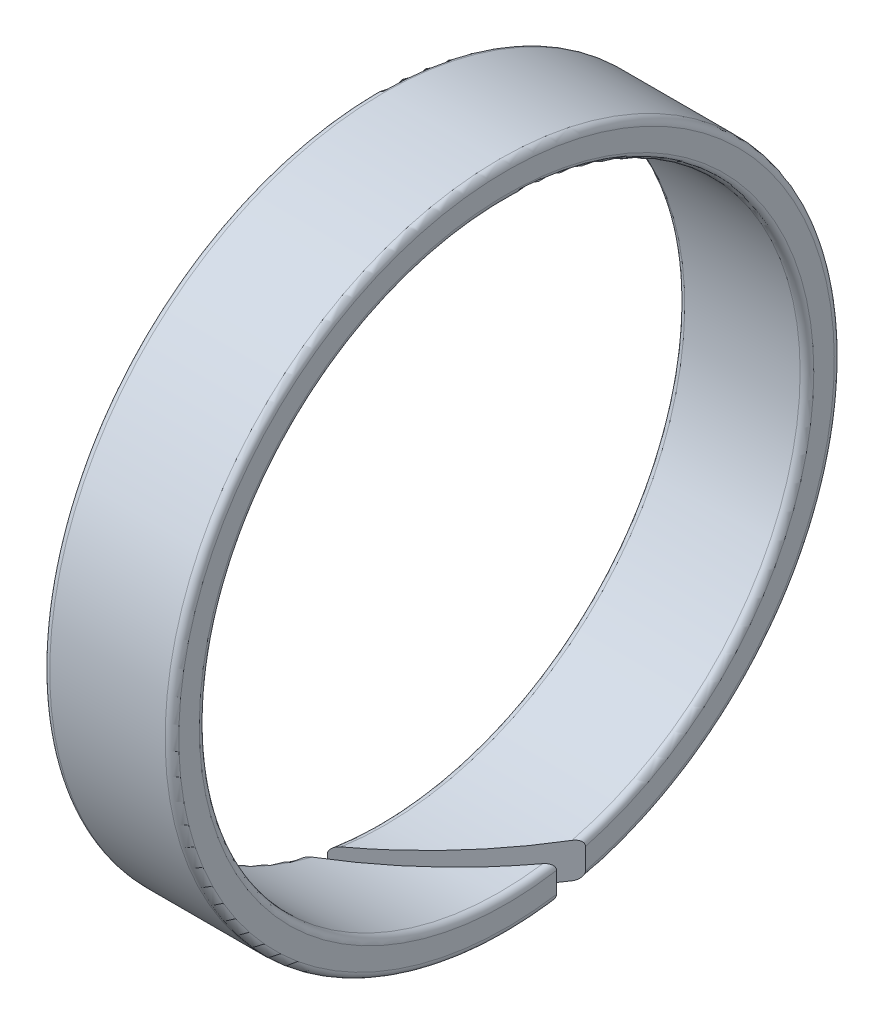
ISO-10303-21;
HEADER;
FILE_DESCRIPTION(('STEP AP214'),'2;1');
FILE_NAME('part.step','',(''),(''),'','','');
FILE_SCHEMA(('AUTOMOTIVE_DESIGN { 1 0 10303 214 1 1 1 1 }'));
ENDSEC;
DATA;
#1=APPLICATION_CONTEXT('core data for automotive mechanical design processes');
#2=APPLICATION_PROTOCOL_DEFINITION('international standard','automotive_design',2000,#1);
#3=PRODUCT_CONTEXT('',#1,'mechanical');
#4=PRODUCT('Part','Part','',(#3));
#5=PRODUCT_RELATED_PRODUCT_CATEGORY('part','',(#4));
#6=PRODUCT_DEFINITION_FORMATION('','',#4);
#7=PRODUCT_DEFINITION_CONTEXT('part definition',#1,'design');
#8=PRODUCT_DEFINITION('design','',#6,#7);
#9=PRODUCT_DEFINITION_SHAPE('','',#8);
#10=(LENGTH_UNIT() NAMED_UNIT(*) SI_UNIT(.MILLI.,.METRE.));
#11=(NAMED_UNIT(*) PLANE_ANGLE_UNIT() SI_UNIT($,.RADIAN.));
#12=(NAMED_UNIT(*) SI_UNIT($,.STERADIAN.) SOLID_ANGLE_UNIT());
#13=UNCERTAINTY_MEASURE_WITH_UNIT(LENGTH_MEASURE(1.E-05),#10,'distance_accuracy_value','');
#14=(GEOMETRIC_REPRESENTATION_CONTEXT(3) GLOBAL_UNCERTAINTY_ASSIGNED_CONTEXT((#13)) GLOBAL_UNIT_ASSIGNED_CONTEXT((#10,
#11,#12)) REPRESENTATION_CONTEXT('',''));
#15=CARTESIAN_POINT('',(0.,0.,0.));
#16=DIRECTION('',(0.,0.,1.));
#17=DIRECTION('',(1.,0.,0.));
#18=AXIS2_PLACEMENT_3D('',#15,#16,#17);
#19=CARTESIAN_POINT('',(4.72500000000009,0.,0.));
#20=DIRECTION('',(1.,0.,0.));
#21=DIRECTION('',(0.,0.,-1.));
#22=AXIS2_PLACEMENT_3D('',#19,#20,#21);
#23=PLANE('',#22);
#24=DIRECTION('',(0.,-1.,0.));
#25=VECTOR('',#24,1.);
#26=CARTESIAN_POINT('',(4.72500000000009,1.11022302462516E-13,-3.6643398282202));
#27=LINE('',#26,#25);
#28=CARTESIAN_POINT('',(4.72500000000009,-22.1996084114861,-3.66433982822021));
#29=VERTEX_POINT('',#28);
#30=CARTESIAN_POINT('',(4.72500000000009,-23.7186132314544,-3.6643398282202));
#31=VERTEX_POINT('',#30);
#32=EDGE_CURVE('E142',#29,#31,#27,.T.);
#33=ORIENTED_EDGE('',*,*,#32,.F.);
#34=CARTESIAN_POINT('',(4.72500000000009,0.,0.));
#35=DIRECTION('',(1.,0.,0.));
#36=DIRECTION('',(0.,0.,-1.));
#37=AXIS2_PLACEMENT_3D('',#34,#35,#36);
#38=CIRCLE('',#37,22.5);
#39=CARTESIAN_POINT('',(4.72500000000009,-21.7434159316489,-5.78566017177985));
#40=VERTEX_POINT('',#39);
#41=EDGE_CURVE('E11',#29,#40,#38,.F.);
#42=ORIENTED_EDGE('',*,*,#41,.T.);
#43=DIRECTION('',(0.,1.,0.));
#44=VECTOR('',#43,1.);
#45=CARTESIAN_POINT('',(4.72500000000009,-24.5,-5.78566017177985));
#46=LINE('',#45,#44);
#47=CARTESIAN_POINT('',(4.72500000000009,-23.2921904589647,-5.78566017177986));
#48=VERTEX_POINT('',#47);
#49=EDGE_CURVE('E251',#48,#40,#46,.T.);
#50=ORIENTED_EDGE('',*,*,#49,.F.);
#51=CARTESIAN_POINT('',(4.72500000000009,0.,0.));
#52=DIRECTION('',(1.,0.,0.));
#53=DIRECTION('',(0.,0.,-1.));
#54=AXIS2_PLACEMENT_3D('',#51,#52,#53);
#55=CIRCLE('',#54,24.);
#56=EDGE_CURVE('E50',#48,#31,#55,.T.);
#57=ORIENTED_EDGE('',*,*,#56,.T.);
#58=EDGE_LOOP('',(#33,#42,#50,#57));
#59=FACE_BOUND('',#58,.T.);
#60=ADVANCED_FACE('F41',(#59),#23,.T.);
#61=CARTESIAN_POINT('',(-4.72500000000009,0.,0.));
#62=DIRECTION('',(1.,0.,0.));
#63=DIRECTION('',(0.,0.,-1.));
#64=AXIS2_PLACEMENT_3D('',#61,#62,#63);
#65=PLANE('',#64);
#66=DIRECTION('',(0.,-1.,0.));
#67=VECTOR('',#66,1.);
#68=CARTESIAN_POINT('',(-4.72500000000009,0.,5.65562475744677));
#69=LINE('',#68,#67);
#70=CARTESIAN_POINT('',(-4.72500000000009,-21.7776010754847,5.65562475744677));
#71=VERTEX_POINT('',#70);
#72=CARTESIAN_POINT('',(-4.72500000000009,-23.3241057406913,5.65562475744677));
#73=VERTEX_POINT('',#72);
#74=EDGE_CURVE('E146',#71,#73,#69,.T.);
#75=ORIENTED_EDGE('',*,*,#74,.T.);
#76=CARTESIAN_POINT('',(-4.72500000000009,0.,0.));
#77=DIRECTION('',(1.,0.,0.));
#78=DIRECTION('',(0.,0.,-1.));
#79=AXIS2_PLACEMENT_3D('',#76,#77,#78);
#80=CIRCLE('',#79,24.);
#81=CARTESIAN_POINT('',(-4.72500000000009,-23.7186132314542,3.6643398282202));
#82=VERTEX_POINT('',#81);
#83=EDGE_CURVE('E210',#73,#82,#80,.F.);
#84=ORIENTED_EDGE('',*,*,#83,.T.);
#85=DIRECTION('',(0.,1.,0.));
#86=VECTOR('',#85,1.);
#87=CARTESIAN_POINT('',(-4.72500000000009,0.,3.66433982822019));
#88=LINE('',#87,#86);
#89=CARTESIAN_POINT('',(-4.72500000000009,-22.1996084114861,3.6643398282202));
#90=VERTEX_POINT('',#89);
#91=EDGE_CURVE('E265',#82,#90,#88,.T.);
#92=ORIENTED_EDGE('',*,*,#91,.T.);
#93=CARTESIAN_POINT('',(-4.72500000000009,0.,0.));
#94=DIRECTION('',(1.,0.,0.));
#95=DIRECTION('',(0.,0.,-1.));
#96=AXIS2_PLACEMENT_3D('',#93,#94,#95);
#97=CIRCLE('',#96,22.5);
#98=EDGE_CURVE('E207',#90,#71,#97,.T.);
#99=ORIENTED_EDGE('',*,*,#98,.T.);
#100=EDGE_LOOP('',(#75,#84,#92,#99));
#101=FACE_BOUND('',#100,.T.);
#102=ADVANCED_FACE('F264',(#101),#65,.F.);
#103=CARTESIAN_POINT('',(4.72500000000009,0.,0.));
#104=DIRECTION('',(-1.,0.,0.));
#105=DIRECTION('',(0.,0.,1.));
#106=AXIS2_PLACEMENT_3D('',#103,#104,#105);
#107=CYLINDRICAL_SURFACE('',#106,24.5);
#108=CARTESIAN_POINT('',(-1.06066017177975,0.,0.));
#109=DIRECTION('',(-0.707106781186549,0.,-0.707106781186548));
#110=DIRECTION('',(-0.707106781186546,0.,0.70710678118655));
#111=AXIS2_PLACEMENT_3D('',#108,#109,#110);
#112=ELLIPSE('',#111,34.6482322781408,24.5);
#113=CARTESIAN_POINT('',(4.22499999999992,-23.923039032457,-5.28566017177984));
#114=VERTEX_POINT('',#113);
#115=CARTESIAN_POINT('',(-4.22499999999992,-24.294792722959,3.1643398282202));
#116=VERTEX_POINT('',#115);
#117=EDGE_CURVE('E135',#114,#116,#112,.T.);
#118=ORIENTED_EDGE('',*,*,#117,.T.);
#119=CARTESIAN_POINT('',(-4.22499999999992,0.,0.));
#120=DIRECTION('',(1.,0.,0.));
#121=DIRECTION('',(0.,0.,-1.));
#122=AXIS2_PLACEMENT_3D('',#119,#120,#121);
#123=CIRCLE('',#122,24.5);
#124=CARTESIAN_POINT('',(-4.22499999999992,-23.923039032457,5.28566017177985));
#125=VERTEX_POINT('',#124);
#126=EDGE_CURVE('E118',#116,#125,#123,.T.);
#127=ORIENTED_EDGE('',*,*,#126,.T.);
#128=CARTESIAN_POINT('',(1.06066017177975,0.,0.));
#129=DIRECTION('',(0.707106781186549,0.,0.707106781186547));
#130=DIRECTION('',(-0.707106781186546,0.,0.707106781186551));
#131=AXIS2_PLACEMENT_3D('',#128,#129,#130);
#132=ELLIPSE('',#131,34.6482322781408,24.5);
#133=CARTESIAN_POINT('',(4.22499999999992,-24.2947927229589,-3.1643398282202));
#134=VERTEX_POINT('',#133);
#135=EDGE_CURVE('E132',#125,#134,#132,.T.);
#136=ORIENTED_EDGE('',*,*,#135,.T.);
#137=CARTESIAN_POINT('',(4.22499999999992,0.,0.));
#138=DIRECTION('',(1.,0.,0.));
#139=DIRECTION('',(0.,0.,-1.));
#140=AXIS2_PLACEMENT_3D('',#137,#138,#139);
#141=CIRCLE('',#140,24.5);
#142=EDGE_CURVE('E137',#134,#114,#141,.F.);
#143=ORIENTED_EDGE('',*,*,#142,.T.);
#144=EDGE_LOOP('',(#118,#127,#136,#143));
#145=FACE_BOUND('',#144,.T.);
#146=ADVANCED_FACE('F131',(#145),#107,.T.);
#147=CARTESIAN_POINT('',(4.72500000000009,0.,0.));
#148=DIRECTION('',(-1.,0.,0.));
#149=DIRECTION('',(0.,0.,1.));
#150=AXIS2_PLACEMENT_3D('',#147,#148,#149);
#151=CYLINDRICAL_SURFACE('',#150,22.);
#152=CARTESIAN_POINT('',(1.06066017177975,0.,0.));
#153=DIRECTION('',(0.707106781186549,0.,0.707106781186547));
#154=DIRECTION('',(-0.707106781186546,0.,0.707106781186551));
#155=AXIS2_PLACEMENT_3D('',#152,#153,#154);
#156=ELLIPSE('',#155,31.112698372208,22.);
#157=CARTESIAN_POINT('',(-4.22499999999992,-21.3556033993062,5.28566017177986));
#158=VERTEX_POINT('',#157);
#159=CARTESIAN_POINT('',(4.22499999999992,-21.7712414311068,-3.1643398282202));
#160=VERTEX_POINT('',#159);
#161=EDGE_CURVE('E144',#158,#160,#156,.T.);
#162=ORIENTED_EDGE('',*,*,#161,.F.);
#163=CARTESIAN_POINT('',(-4.22499999999992,0.,0.));
#164=DIRECTION('',(1.,0.,0.));
#165=DIRECTION('',(0.,0.,-1.));
#166=AXIS2_PLACEMENT_3D('',#163,#164,#165);
#167=CIRCLE('',#166,22.);
#168=CARTESIAN_POINT('',(-4.22499999999992,-21.7712414311068,3.16433982822018));
#169=VERTEX_POINT('',#168);
#170=EDGE_CURVE('E57',#158,#169,#167,.F.);
#171=ORIENTED_EDGE('',*,*,#170,.T.);
#172=CARTESIAN_POINT('',(-1.06066017177975,0.,0.));
#173=DIRECTION('',(-0.707106781186549,0.,-0.707106781186548));
#174=DIRECTION('',(-0.707106781186546,0.,0.70710678118655));
#175=AXIS2_PLACEMENT_3D('',#172,#173,#174);
#176=ELLIPSE('',#175,31.112698372208,22.);
#177=CARTESIAN_POINT('',(4.22499999999992,-21.3556033993062,-5.28566017177985));
#178=VERTEX_POINT('',#177);
#179=EDGE_CURVE('E141',#178,#169,#176,.T.);
#180=ORIENTED_EDGE('',*,*,#179,.F.);
#181=CARTESIAN_POINT('',(4.22499999999992,0.,0.));
#182=DIRECTION('',(1.,0.,0.));
#183=DIRECTION('',(0.,0.,-1.));
#184=AXIS2_PLACEMENT_3D('',#181,#182,#183);
#185=CIRCLE('',#184,22.);
#186=EDGE_CURVE('E242',#178,#160,#185,.T.);
#187=ORIENTED_EDGE('',*,*,#186,.T.);
#188=EDGE_LOOP('',(#162,#171,#180,#187));
#189=FACE_BOUND('',#188,.T.);
#190=ADVANCED_FACE('F225',(#189),#151,.F.);
#191=CARTESIAN_POINT('',(4.72500000000009,-24.5,-5.78566017177985));
#192=DIRECTION('',(-0.707106781186549,0.,-0.707106781186548));
#193=DIRECTION('',(-0.707106781186546,0.,0.70710678118655));
#194=AXIS2_PLACEMENT_3D('',#191,#192,#193);
#195=PLANE('',#194);
#196=ORIENTED_EDGE('',*,*,#91,.F.);
#197=CARTESIAN_POINT('',(-4.72500000000009,-23.7186132314542,3.6643398282202));
#198=CARTESIAN_POINT('',(-4.72502574535306,-23.7434351918554,3.66436557357337));
#199=CARTESIAN_POINT('',(-4.72319771201983,-23.7681376161173,3.66253754024013));
#200=CARTESIAN_POINT('',(-4.7163786361888,-23.816406350749,3.655718464409));
#201=CARTESIAN_POINT('',(-4.71142041544761,-23.8399817519745,3.65076024366771));
#202=CARTESIAN_POINT('',(-4.69889986263721,-23.8855105801526,3.63823969085734));
#203=CARTESIAN_POINT('',(-4.69135220603893,-23.9074723186344,3.63069203425917));
#204=CARTESIAN_POINT('',(-4.67412939870489,-23.9497169507442,3.61346922692514));
#205=CARTESIAN_POINT('',(-4.66444792037909,-23.9699945988448,3.60378774859923));
#206=CARTESIAN_POINT('',(-4.63759007168309,-24.0193511593527,3.57692989990313));
#207=CARTESIAN_POINT('',(-4.61922084837744,-24.0471338238574,3.55856067659763));
#208=CARTESIAN_POINT('',(-4.57959902970563,-24.0982141491201,3.51893885792595));
#209=CARTESIAN_POINT('',(-4.55834069055153,-24.1215026460847,3.49768051877184));
#210=CARTESIAN_POINT('',(-4.50626611768633,-24.1708032212297,3.44560594590661));
#211=CARTESIAN_POINT('',(-4.47463875436181,-24.1951003110115,3.41397858258208));
#212=CARTESIAN_POINT('',(-4.4090496578634,-24.2361327057072,3.34838948608362));
#213=CARTESIAN_POINT('',(-4.37508755648262,-24.2528668147118,3.31442738470282));
#214=CARTESIAN_POINT('',(-4.32149782090872,-24.2729421542483,3.26083764912893));
#215=CARTESIAN_POINT('',(-4.30234382523602,-24.2789166029107,3.24168365345625));
#216=CARTESIAN_POINT('',(-4.26382013578095,-24.2885682227616,3.20315996400121));
#217=CARTESIAN_POINT('',(-4.24445147403079,-24.2922536330969,3.18379130225107));
#218=CARTESIAN_POINT('',(-4.22499999999992,-24.294792722959,3.1643398282202));
#219=B_SPLINE_CURVE_WITH_KNOTS('',3,(#197,#198,#199,#200,#201,#202,#203,#204,#205,#206,#207,
#208,#209,#210,#211,#212,#213,#214,#215,#216,#217,#218),.UNSPECIFIED.,.F.,.F.,(4,2,2,2,2,2,2,2,
2,2,4),(0.,0.0741535930199235,0.147542272828984,0.220521715661739,0.293720553752011,
0.407194763510153,0.520897962145091,0.672813646074002,0.824753343529323,0.907884486703509,
0.990714647419734),.UNSPECIFIED.);
#220=EDGE_CURVE('E236',#82,#116,#219,.T.);
#221=ORIENTED_EDGE('',*,*,#220,.T.);
#222=ORIENTED_EDGE('',*,*,#117,.F.);
#223=CARTESIAN_POINT('',(4.22499999999992,-23.923039032457,-5.28566017177984));
#224=CARTESIAN_POINT('',(4.24494577581343,-23.9186245205073,-5.30560594759326));
#225=CARTESIAN_POINT('',(4.26474376324025,-23.913009585674,-5.32540393502003));
#226=CARTESIAN_POINT('',(4.30394457164939,-23.8994475482932,-5.36460474342914));
#227=CARTESIAN_POINT('',(4.32334723916251,-23.8914995577955,-5.38400741094227));
#228=CARTESIAN_POINT('',(4.3810285456558,-23.8641524933544,-5.44168871743558));
#229=CARTESIAN_POINT('',(4.41852925524987,-23.8413069213466,-5.47918942702968));
#230=CARTESIAN_POINT('',(4.48389383898145,-23.7915414722216,-5.54455401076122));
#231=CARTESIAN_POINT('',(4.51229833043169,-23.7660250811168,-5.5729585022114));
#232=CARTESIAN_POINT('',(4.5658518846688,-23.708959159415,-5.62651205644861));
#233=CARTESIAN_POINT('',(4.59101042994047,-23.6774279014211,-5.65167060172044));
#234=CARTESIAN_POINT('',(4.62968548568362,-23.6189342191185,-5.69034565746352));
#235=CARTESIAN_POINT('',(4.6444011572704,-23.593555564788,-5.70506132905019));
#236=CARTESIAN_POINT('',(4.67096178838825,-23.5399081942305,-5.73162196016799));
#237=CARTESIAN_POINT('',(4.682808943212,-23.5116417117846,-5.7434691149918));
#238=CARTESIAN_POINT('',(4.70034265692375,-23.4595483197467,-5.76100282870357));
#239=CARTESIAN_POINT('',(4.70682393104252,-23.4362585301551,-5.76748410282231));
#240=CARTESIAN_POINT('',(4.71704725724746,-23.3885408687962,-5.7777074290272));
#241=CARTESIAN_POINT('',(4.72079872433679,-23.3641172207883,-5.78145889611651));
#242=CARTESIAN_POINT('',(4.72429721960384,-23.3237604529211,-5.78495739138359));
#243=CARTESIAN_POINT('',(4.72500643457529,-23.3079847597282,-5.78566660635506));
#244=CARTESIAN_POINT('',(4.72500000000009,-23.2921904589647,-5.78566017177992));
#245=B_SPLINE_CURVE_WITH_KNOTS('',3,(#223,#224,#225,#226,#227,#228,#229,#230,#231,#232,#233,
#234,#235,#236,#237,#238,#239,#240,#241,#242,#243,#244),.UNSPECIFIED.,.F.,.F.,(4,2,2,2,2,2,2,2,
2,2,4),(0.,0.0855869288494878,0.171206474014893,0.343511969365694,0.485794995666126,
0.627652471578651,0.725819855262002,0.82391187171158,0.898738585290563,0.973305985024754,
1.0206353079187),.UNSPECIFIED.);
#246=EDGE_CURVE('E212',#114,#48,#245,.T.);
#247=ORIENTED_EDGE('',*,*,#246,.T.);
#248=ORIENTED_EDGE('',*,*,#49,.T.);
#249=CARTESIAN_POINT('',(4.72500000000009,-21.7434159316489,-5.78566017177985));
#250=CARTESIAN_POINT('',(4.72503080217776,-21.723422635209,-5.78569097395744));
#251=CARTESIAN_POINT('',(4.72388209365464,-21.7034051051762,-5.78454226543435));
#252=CARTESIAN_POINT('',(4.71922587907662,-21.6639725681301,-5.77988605085644));
#253=CARTESIAN_POINT('',(4.71572329389258,-21.6445563923636,-5.77638346567247));
#254=CARTESIAN_POINT('',(4.70634736805702,-21.6068395114554,-5.76700753983687));
#255=CARTESIAN_POINT('',(4.70046780379788,-21.5885418809002,-5.76112797557762));
#256=CARTESIAN_POINT('',(4.6865754424967,-21.5536685061576,-5.74723561427648));
#257=CARTESIAN_POINT('',(4.67856357235355,-21.5370920181431,-5.73922374413349));
#258=CARTESIAN_POINT('',(4.66093399072649,-21.5063028595342,-5.72159416250644));
#259=CARTESIAN_POINT('',(4.65135095250732,-21.4920501182704,-5.71201112428713));
#260=CARTESIAN_POINT('',(4.63083771558794,-21.4656396704597,-5.69149788736766));
#261=CARTESIAN_POINT('',(4.61990635755794,-21.4534837887038,-5.68056652933772));
#262=CARTESIAN_POINT('',(4.59127737891901,-21.4256628503244,-5.65193755069883));
#263=CARTESIAN_POINT('',(4.57294208204752,-21.4113082712652,-5.6336022538273));
#264=CARTESIAN_POINT('',(4.53488651815525,-21.3869204873307,-5.595546689935));
#265=CARTESIAN_POINT('',(4.51516307379353,-21.376897597806,-5.57582324557329));
#266=CARTESIAN_POINT('',(4.46604892493506,-21.3570969151367,-5.52670909671483));
#267=CARTESIAN_POINT('',(4.43624374075571,-21.3493916535786,-5.49690391253547));
#268=CARTESIAN_POINT('',(4.37616198080344,-21.3406593775155,-5.4368221525832));
#269=CARTESIAN_POINT('',(4.34588478657716,-21.3396420209315,-5.40654495835693));
#270=CARTESIAN_POINT('',(4.3004704473881,-21.3424441711289,-5.36113061916785));
#271=CARTESIAN_POINT('',(4.28524861409996,-21.3441210437257,-5.34590878587971));
#272=CARTESIAN_POINT('',(4.25499211660827,-21.3488546450069,-5.31565228838805));
#273=CARTESIAN_POINT('',(4.239956890864,-21.3519041598656,-5.30061706264383));
#274=CARTESIAN_POINT('',(4.22499999999992,-21.3556033993062,-5.28566017177985));
#275=B_SPLINE_CURVE_WITH_KNOTS('',3,(#249,#250,#251,#252,#253,#254,#255,#256,#257,#258,#259,
#260,#261,#262,#263,#264,#265,#266,#267,#268,#269,#270,#271,#272,#273,#274),.UNSPECIFIED.,.F.,
.F.,(4,2,2,2,2,2,2,2,2,2,2,2,4),(0.,0.0599463639295992,0.119767795885666,0.179746882395255,
0.239699938867074,0.298474139996363,0.357299234091442,0.445713654335123,0.53433747707352,
0.66219223371116,0.790231583339687,0.854969522164011,0.919371137300166),.UNSPECIFIED.);
#276=EDGE_CURVE('E64',#40,#178,#275,.T.);
#277=ORIENTED_EDGE('',*,*,#276,.T.);
#278=ORIENTED_EDGE('',*,*,#179,.T.);
#279=CARTESIAN_POINT('',(-4.22499999999992,-21.7712414311068,3.16433982822019));
#280=CARTESIAN_POINT('',(-4.24371416488033,-21.768527773343,3.18305399310059));
#281=CARTESIAN_POINT('',(-4.26250800503816,-21.7668275169239,3.20184783325842));
#282=CARTESIAN_POINT('',(-4.30017324665307,-21.7655669189806,3.23951307487331));
#283=CARTESIAN_POINT('',(-4.31904472731068,-21.7660114495524,3.25838455553092));
#284=CARTESIAN_POINT('',(-4.35691817784309,-21.7691854400539,3.29625800606334));
#285=CARTESIAN_POINT('',(-4.37591908042947,-21.7719416508372,3.31525890864973));
#286=CARTESIAN_POINT('',(-4.4136393944048,-21.779942981608,3.35297922262504));
#287=CARTESIAN_POINT('',(-4.43235908160961,-21.7851854728201,3.37169890982983));
#288=CARTESIAN_POINT('',(-4.47350628857235,-21.7998654928169,3.41284611679257));
#289=CARTESIAN_POINT('',(-4.49581644367145,-21.8099830301493,3.43515627189171));
#290=CARTESIAN_POINT('',(-4.53909430169969,-21.8347343662532,3.47843412991993));
#291=CARTESIAN_POINT('',(-4.56006650872517,-21.8493519289904,3.49940633694535));
#292=CARTESIAN_POINT('',(-4.5954514934466,-21.8797867720102,3.53479132166682));
#293=CARTESIAN_POINT('',(-4.61028631675471,-21.8946157584383,3.54962614497499));
#294=CARTESIAN_POINT('',(-4.63809150044759,-21.9274509274748,3.57743132866782));
#295=CARTESIAN_POINT('',(-4.65106417863904,-21.94545309711,3.59040400685914));
#296=CARTESIAN_POINT('',(-4.67232411089204,-21.981001848293,3.61166393911215));
#297=CARTESIAN_POINT('',(-4.6810344272428,-21.9980403513671,3.62037425546301));
#298=CARTESIAN_POINT('',(-4.69632505388754,-22.0339304816589,3.63566488210784));
#299=CARTESIAN_POINT('',(-4.7029075302434,-22.0527802395604,3.64224735846369));
#300=CARTESIAN_POINT('',(-4.71377312201837,-22.0924858685557,3.65311295023865));
#301=CARTESIAN_POINT('',(-4.71797342413932,-22.1133873486408,3.6573132523596));
#302=CARTESIAN_POINT('',(-4.72361827990202,-22.1560578735107,3.66295810812224));
#303=CARTESIAN_POINT('',(-4.72504517726632,-22.1778315819392,3.6643850054865));
#304=CARTESIAN_POINT('',(-4.72500000000009,-22.1996084114861,3.6643398282202));
#305=B_SPLINE_CURVE_WITH_KNOTS('',3,(#279,#280,#281,#282,#283,#284,#285,#286,#287,#288,#289,
#290,#291,#292,#293,#294,#295,#296,#297,#298,#299,#300,#301,#302,#303,#304),.UNSPECIFIED.,.F.,
.F.,(4,2,2,2,2,2,2,2,2,2,2,2,4),(0.,0.0798069715620714,0.159795317800918,0.240722271860277,
0.321563850952885,0.420662149858195,0.519407012660938,0.596210689582476,0.672917924468527,
0.735731398213507,0.798480727337478,0.86329541380493,0.928521394526833),.UNSPECIFIED.);
#306=EDGE_CURVE('E231',#169,#90,#305,.T.);
#307=ORIENTED_EDGE('',*,*,#306,.T.);
#308=EDGE_LOOP('',(#196,#221,#222,#247,#248,#277,#278,#307));
#309=FACE_BOUND('',#308,.T.);
#310=ADVANCED_FACE('F169',(#309),#195,.F.);
#311=CARTESIAN_POINT('',(5.78566017177984,-24.5000000000001,-4.72500000000004));
#312=DIRECTION('',(0.707106781186549,0.,0.707106781186547));
#313=DIRECTION('',(0.707106781186546,0.,-0.707106781186551));
#314=AXIS2_PLACEMENT_3D('',#311,#312,#313);
#315=PLANE('',#314);
#316=ORIENTED_EDGE('',*,*,#135,.F.);
#317=CARTESIAN_POINT('',(-4.22499999999992,-23.923039032457,5.28566017177985));
#318=CARTESIAN_POINT('',(-4.24490806013504,-23.9186327935129,5.3055682319149));
#319=CARTESIAN_POINT('',(-4.26466869211361,-23.9130308481497,5.32532886389345));
#320=CARTESIAN_POINT('',(-4.30379710789867,-23.899503271281,5.36445727967849));
#321=CARTESIAN_POINT('',(-4.32316472747462,-23.8915766889072,5.38382489925445));
#322=CARTESIAN_POINT('',(-4.38088847877863,-23.8642377263435,5.44154865055846));
#323=CARTESIAN_POINT('',(-4.41846325323354,-23.8413565501313,5.47912342501336));
#324=CARTESIAN_POINT('',(-4.48394092310796,-23.7915061381064,5.54460109488775));
#325=CARTESIAN_POINT('',(-4.51238758390936,-23.7659463612653,5.57304775568913));
#326=CARTESIAN_POINT('',(-4.56593618547184,-23.7088529827474,5.62659635725172));
#327=CARTESIAN_POINT('',(-4.59105779076058,-23.6773574449405,5.65171796254059));
#328=CARTESIAN_POINT('',(-4.62222902609316,-23.6302112328972,5.68288919787308));
#329=CARTESIAN_POINT('',(-4.63027962468818,-23.6171613182242,5.69093979646804));
#330=CARTESIAN_POINT('',(-4.64568260822904,-23.590225606047,5.70634278000884));
#331=CARTESIAN_POINT('',(-4.65303374524748,-23.5763383841919,5.71369391702727));
#332=CARTESIAN_POINT('',(-4.65998229283349,-23.5620411070319,5.72064246461332));
#333=B_SPLINE_CURVE_WITH_KNOTS('',3,(#317,#318,#319,#320,#321,#322,#323,#324,#325,#326,#327,
#328,#329,#330,#331,#332),.UNSPECIFIED.,.F.,.F.,(4,2,2,2,2,2,2,4),(0.,0.0854246824684147,
0.170884355853425,0.343511098118828,0.486023696420126,0.62765172804726,0.679566522392057,
0.731572267579096),.UNSPECIFIED.);
#334=CARTESIAN_POINT('',(-4.65998229283349,-23.5620411070319,5.72064246461332));
#335=VERTEX_POINT('',#334);
#336=EDGE_CURVE('E114',#125,#335,#333,.T.);
#337=ORIENTED_EDGE('',*,*,#336,.T.);
#338=DIRECTION('',(0.,1.,0.));
#339=VECTOR('',#338,1.);
#340=CARTESIAN_POINT('',(-4.65998229283349,-24.5,5.72064246461331));
#341=LINE('',#340,#339);
#342=CARTESIAN_POINT('',(-4.65998229283349,-21.5055799868962,5.72064246461332));
#343=VERTEX_POINT('',#342);
#344=EDGE_CURVE('E270',#335,#343,#341,.T.);
#345=ORIENTED_EDGE('',*,*,#344,.T.);
#346=CARTESIAN_POINT('',(-4.65998229283349,-21.5055799868962,5.72064246461332));
#347=CARTESIAN_POINT('',(-4.64681472615512,-21.4850336125127,5.707474897935));
#348=CARTESIAN_POINT('',(-4.63215591485567,-21.4666602355498,5.69281608663553));
#349=CARTESIAN_POINT('',(-4.60092455402185,-21.4342898026785,5.66158472580165));
#350=CARTESIAN_POINT('',(-4.58438540708571,-21.420228978123,5.64504557886546));
#351=CARTESIAN_POINT('',(-4.54539484570327,-21.3926279667466,5.60605501748301));
#352=CARTESIAN_POINT('',(-4.52254646889172,-21.3802361716067,5.58320664067152));
#353=CARTESIAN_POINT('',(-4.47553678969251,-21.3606145749274,5.53619696147237));
#354=CARTESIAN_POINT('',(-4.45136349381093,-21.3534451997424,5.51202366559078));
#355=CARTESIAN_POINT('',(-4.39309897027911,-21.3418570893625,5.45375914205896));
#356=CARTESIAN_POINT('',(-4.35879382942348,-21.3395802955944,5.41945400120333));
#357=CARTESIAN_POINT('',(-4.30790405028988,-21.341752393338,5.36856422206971));
#358=CARTESIAN_POINT('',(-4.29121413343926,-21.3433609833499,5.35187430521908));
#359=CARTESIAN_POINT('',(-4.25798647990944,-21.3482549459218,5.31864665168928));
#360=CARTESIAN_POINT('',(-4.24144852733349,-21.3515373667114,5.30210869911336));
#361=CARTESIAN_POINT('',(-4.22499999999992,-21.3556033993062,5.28566017177986));
#362=B_SPLINE_CURVE_WITH_KNOTS('',3,(#346,#347,#348,#349,#350,#351,#352,#353,#354,#355,#356,
#357,#358,#359,#360,#361),.UNSPECIFIED.,.F.,.F.,(4,2,2,2,2,2,2,4),(0.,0.0827427628214315,
0.164195404629559,0.267466799064233,0.371914902979448,0.516830887378037,0.587760842149745,
0.658566143573506),.UNSPECIFIED.);
#363=EDGE_CURVE('E126',#343,#158,#362,.T.);
#364=ORIENTED_EDGE('',*,*,#363,.T.);
#365=ORIENTED_EDGE('',*,*,#161,.T.);
#366=CARTESIAN_POINT('',(4.22499999999992,-21.7712414311068,-3.1643398282202));
#367=CARTESIAN_POINT('',(4.24371416488037,-21.768527773343,-3.18305399310059));
#368=CARTESIAN_POINT('',(4.26250800503822,-21.7668275169239,-3.20184783325842));
#369=CARTESIAN_POINT('',(4.30017324665315,-21.7655669189806,-3.23951307487334));
#370=CARTESIAN_POINT('',(4.31904472731076,-21.7660114495524,-3.25838455553095));
#371=CARTESIAN_POINT('',(4.35691817784317,-21.7691854400539,-3.29625800606336));
#372=CARTESIAN_POINT('',(4.37591908042954,-21.7719416508372,-3.31525890864973));
#373=CARTESIAN_POINT('',(4.41363939440483,-21.779942981608,-3.35297922262503));
#374=CARTESIAN_POINT('',(4.43235908160962,-21.7851854728201,-3.37169890982983));
#375=CARTESIAN_POINT('',(4.47350628857236,-21.7998654928169,-3.41284611679257));
#376=CARTESIAN_POINT('',(4.4958164436715,-21.8099830301493,-3.4351562718917));
#377=CARTESIAN_POINT('',(4.53909430169973,-21.8347343662533,-3.47843412991991));
#378=CARTESIAN_POINT('',(4.56006650872514,-21.8493519289907,-3.49940633694532));
#379=CARTESIAN_POINT('',(4.5954514934466,-21.8797867720104,-3.5347913216668));
#380=CARTESIAN_POINT('',(4.61028631675476,-21.8946157584384,-3.54962614497497));
#381=CARTESIAN_POINT('',(4.63809150044765,-21.9274509274748,-3.57743132866782));
#382=CARTESIAN_POINT('',(4.65106417863906,-21.94545309711,-3.59040400685916));
#383=CARTESIAN_POINT('',(4.67232411089204,-21.981001848293,-3.61166393911215));
#384=CARTESIAN_POINT('',(4.68103442724282,-21.9980403513671,-3.62037425546297));
#385=CARTESIAN_POINT('',(4.69632505388756,-22.033930481659,-3.63566488210781));
#386=CARTESIAN_POINT('',(4.7029075302434,-22.0527802395605,-3.64224735846369));
#387=CARTESIAN_POINT('',(4.71377312201836,-22.0924858685558,-3.65311295023866));
#388=CARTESIAN_POINT('',(4.71797342413933,-22.1133873486409,-3.65731325235957));
#389=CARTESIAN_POINT('',(4.72361827990203,-22.1560578735108,-3.66295810812218));
#390=CARTESIAN_POINT('',(4.72504517726634,-22.1778315819392,-3.66438500548644));
#391=CARTESIAN_POINT('',(4.72500000000009,-22.1996084114861,-3.66433982822021));
#392=B_SPLINE_CURVE_WITH_KNOTS('',3,(#366,#367,#368,#369,#370,#371,#372,#373,#374,#375,#376,
#377,#378,#379,#380,#381,#382,#383,#384,#385,#386,#387,#388,#389,#390,#391),.UNSPECIFIED.,.F.,
.F.,(4,2,2,2,2,2,2,2,2,2,2,2,4),(0.,0.0798069715621202,0.159795317801006,0.240722271860308,
0.321563850952868,0.420662149858207,0.519407012661017,0.596210689582502,0.672917924468475,
0.735731398213495,0.798480727337523,0.86329541380494,0.928521394526763),.UNSPECIFIED.);
#393=EDGE_CURVE('E159',#160,#29,#392,.T.);
#394=ORIENTED_EDGE('',*,*,#393,.T.);
#395=ORIENTED_EDGE('',*,*,#32,.T.);
#396=CARTESIAN_POINT('',(4.72500000000009,-23.7186132314544,-3.6643398282202));
#397=CARTESIAN_POINT('',(4.72502574535307,-23.7434351918556,-3.66436557357328));
#398=CARTESIAN_POINT('',(4.72319771201982,-23.7681376161174,-3.66253754024004));
#399=CARTESIAN_POINT('',(4.71637863618878,-23.8164063507491,-3.65571846440895));
#400=CARTESIAN_POINT('',(4.71142041544758,-23.8399817519746,-3.65076024366771));
#401=CARTESIAN_POINT('',(4.69889986263723,-23.8855105801526,-3.63823969085734));
#402=CARTESIAN_POINT('',(4.69135220603899,-23.9074723186344,-3.63069203425913));
#403=CARTESIAN_POINT('',(4.67412939870485,-23.9497169507441,-3.6134692269251));
#404=CARTESIAN_POINT('',(4.66444792037891,-23.9699945988447,-3.60378774859922));
#405=CARTESIAN_POINT('',(4.63759007168281,-24.0193511593525,-3.57692989990314));
#406=CARTESIAN_POINT('',(4.61922084837738,-24.0471338238574,-3.55856067659759));
#407=CARTESIAN_POINT('',(4.57959902970571,-24.0982141491202,-3.51893885792589));
#408=CARTESIAN_POINT('',(4.55834069055155,-24.1215026460847,-3.49768051877182));
#409=CARTESIAN_POINT('',(4.5062661176863,-24.1708032212296,-3.44560594590662));
#410=CARTESIAN_POINT('',(4.47463875436184,-24.1951003110115,-3.41397858258206));
#411=CARTESIAN_POINT('',(4.40904965786343,-24.2361327057071,-3.3483894860836));
#412=CARTESIAN_POINT('',(4.37508755648262,-24.2528668147118,-3.31442738470284));
#413=CARTESIAN_POINT('',(4.32149782090872,-24.2729421542483,-3.26083764912893));
#414=CARTESIAN_POINT('',(4.30234382523604,-24.2789166029107,-3.24168365345623));
#415=CARTESIAN_POINT('',(4.26382013578099,-24.2885682227616,-3.20315996400118));
#416=CARTESIAN_POINT('',(4.24445147403083,-24.2922536330969,-3.18379130225103));
#417=CARTESIAN_POINT('',(4.22499999999992,-24.2947927229589,-3.1643398282202));
#418=B_SPLINE_CURVE_WITH_KNOTS('',3,(#396,#397,#398,#399,#400,#401,#402,#403,#404,#405,#406,
#407,#408,#409,#410,#411,#412,#413,#414,#415,#416,#417),.UNSPECIFIED.,.F.,.F.,(4,2,2,2,2,2,2,2,
2,2,4),(0.,0.0741535930198298,0.147542272828756,0.220521715661499,0.293720553751776,
0.407194763509921,0.52089796214483,0.672813646073718,0.824753343529049,0.90788448670324,
0.990714647419455),.UNSPECIFIED.);
#419=EDGE_CURVE('E136',#31,#134,#418,.T.);
#420=ORIENTED_EDGE('',*,*,#419,.T.);
#421=EDGE_LOOP('',(#316,#337,#345,#364,#365,#394,#395,#420));
#422=FACE_BOUND('',#421,.T.);
#423=ADVANCED_FACE('F139',(#422),#315,.F.);
#424=CARTESIAN_POINT('',(-5.72064246461323,-24.5,4.65998229283348));
#425=DIRECTION('',(-0.707106781186546,0.,0.707106781186551));
#426=DIRECTION('',(0.707106781186549,0.,0.707106781186547));
#427=AXIS2_PLACEMENT_3D('',#424,#425,#426);
#428=PLANE('',#427);
#429=ORIENTED_EDGE('',*,*,#344,.F.);
#430=CARTESIAN_POINT('',(-4.65998229283349,-23.5620411070319,5.72064246461332));
#431=CARTESIAN_POINT('',(-4.66946035506534,-23.5471948756395,5.71116440238142));
#432=CARTESIAN_POINT('',(-4.67810190339976,-23.5312439388512,5.70252285404697));
#433=CARTESIAN_POINT('',(-4.6934104875958,-23.4975366305034,5.68721426985089));
#434=CARTESIAN_POINT('',(-4.70007614730447,-23.4797790121472,5.68054861014221));
#435=CARTESIAN_POINT('',(-4.7111347367116,-23.4428263187765,5.66949002073508));
#436=CARTESIAN_POINT('',(-4.71552048192678,-23.42362691532,5.66510427551991));
#437=CARTESIAN_POINT('',(-4.72185694209268,-23.3844917562431,5.65876781535406));
#438=CARTESIAN_POINT('',(-4.72381382045682,-23.3645579971507,5.65681093698996));
#439=CARTESIAN_POINT('',(-4.72486925928634,-23.3377426770492,5.65575549816049));
#440=CARTESIAN_POINT('',(-4.72500172667671,-23.3309218223748,5.65562303077013));
#441=CARTESIAN_POINT('',(-4.72500000000009,-23.3241057406913,5.65562475744677));
#442=B_SPLINE_CURVE_WITH_KNOTS('',3,(#430,#431,#432,#433,#434,#435,#436,#437,#438,#439,#440,
#441),.UNSPECIFIED.,.F.,.F.,(4,2,2,2,2,4),(0.,0.059986307957833,0.120014297119875,
0.180230317457538,0.240293221098957,0.260750824633003),.UNSPECIFIED.);
#443=EDGE_CURVE('E120',#335,#73,#442,.T.);
#444=ORIENTED_EDGE('',*,*,#443,.T.);
#445=ORIENTED_EDGE('',*,*,#74,.F.);
#446=CARTESIAN_POINT('',(-4.72500000000009,-21.7776010754847,5.65562475744677));
#447=CARTESIAN_POINT('',(-4.72501287104173,-21.7496742186093,5.65561188640506));
#448=CARTESIAN_POINT('',(-4.72281303576869,-21.7219315334959,5.65781172167805));
#449=CARTESIAN_POINT('',(-4.71483616530698,-21.6681494747579,5.6657885921397));
#450=CARTESIAN_POINT('',(-4.7091446965397,-21.6420853631978,5.67148006090697));
#451=CARTESIAN_POINT('',(-4.6965981323857,-21.5974385606086,5.68402662506099));
#452=CARTESIAN_POINT('',(-4.69031469186371,-21.5785174531364,5.69031006558299));
#453=CARTESIAN_POINT('',(-4.676226360279,-21.541384155164,5.70439839716772));
#454=CARTESIAN_POINT('',(-4.6683954343626,-21.5231915975139,5.71222932308412));
#455=CARTESIAN_POINT('',(-4.65998229283349,-21.5055799868962,5.72064246461319));
#456=B_SPLINE_CURVE_WITH_KNOTS('',3,(#446,#447,#448,#449,#450,#451,#452,#453,#454,#455),
.UNSPECIFIED.,.F.,.F.,(4,2,2,2,4),(0.,0.0833473028385233,0.164729436975305,0.227330441496095,
0.29109143597239),.UNSPECIFIED.);
#457=EDGE_CURVE('E125',#71,#343,#456,.T.);
#458=ORIENTED_EDGE('',*,*,#457,.T.);
#459=EDGE_LOOP('',(#429,#444,#445,#458));
#460=FACE_BOUND('',#459,.T.);
#461=ADVANCED_FACE('F168',(#460),#428,.F.);
#462=CARTESIAN_POINT('',(-4.22499999999992,0.,0.));
#463=DIRECTION('',(1.,0.,0.));
#464=DIRECTION('',(0.,0.,-1.));
#465=AXIS2_PLACEMENT_3D('',#462,#463,#464);
#466=TOROIDAL_SURFACE('',#465,24.,0.5);
#467=ORIENTED_EDGE('',*,*,#220,.F.);
#468=ORIENTED_EDGE('',*,*,#83,.F.);
#469=ORIENTED_EDGE('',*,*,#443,.F.);
#470=ORIENTED_EDGE('',*,*,#336,.F.);
#471=ORIENTED_EDGE('',*,*,#126,.F.);
#472=EDGE_LOOP('',(#467,#468,#469,#470,#471));
#473=FACE_BOUND('',#472,.T.);
#474=ADVANCED_FACE('F117',(#473),#466,.T.);
#475=CARTESIAN_POINT('',(-4.22499999999992,0.,0.));
#476=DIRECTION('',(1.,0.,0.));
#477=DIRECTION('',(0.,0.,-1.));
#478=AXIS2_PLACEMENT_3D('',#475,#476,#477);
#479=TOROIDAL_SURFACE('',#478,22.5,0.5);
#480=ORIENTED_EDGE('',*,*,#306,.F.);
#481=ORIENTED_EDGE('',*,*,#170,.F.);
#482=ORIENTED_EDGE('',*,*,#363,.F.);
#483=ORIENTED_EDGE('',*,*,#457,.F.);
#484=ORIENTED_EDGE('',*,*,#98,.F.);
#485=EDGE_LOOP('',(#480,#481,#482,#483,#484));
#486=FACE_BOUND('',#485,.T.);
#487=ADVANCED_FACE('F186',(#486),#479,.T.);
#488=CARTESIAN_POINT('',(4.22499999999992,0.,0.));
#489=DIRECTION('',(1.,0.,0.));
#490=DIRECTION('',(0.,0.,-1.));
#491=AXIS2_PLACEMENT_3D('',#488,#489,#490);
#492=TOROIDAL_SURFACE('',#491,22.5,0.5);
#493=ORIENTED_EDGE('',*,*,#276,.F.);
#494=ORIENTED_EDGE('',*,*,#41,.F.);
#495=ORIENTED_EDGE('',*,*,#393,.F.);
#496=ORIENTED_EDGE('',*,*,#186,.F.);
#497=EDGE_LOOP('',(#493,#494,#495,#496));
#498=FACE_BOUND('',#497,.T.);
#499=ADVANCED_FACE('F189',(#498),#492,.T.);
#500=CARTESIAN_POINT('',(4.22499999999992,0.,0.));
#501=DIRECTION('',(1.,0.,0.));
#502=DIRECTION('',(0.,0.,-1.));
#503=AXIS2_PLACEMENT_3D('',#500,#501,#502);
#504=TOROIDAL_SURFACE('',#503,24.,0.5);
#505=ORIENTED_EDGE('',*,*,#246,.F.);
#506=ORIENTED_EDGE('',*,*,#142,.F.);
#507=ORIENTED_EDGE('',*,*,#419,.F.);
#508=ORIENTED_EDGE('',*,*,#56,.F.);
#509=EDGE_LOOP('',(#505,#506,#507,#508));
#510=FACE_BOUND('',#509,.T.);
#511=ADVANCED_FACE('F43',(#510),#504,.T.);
#512=CLOSED_SHELL('',(#60,#102,#146,#190,#310,#423,#461,#474,#487,#499,#511));
#513=MANIFOLD_SOLID_BREP('B2',#512);
#514=ADVANCED_BREP_SHAPE_REPRESENTATION('',(#18,#513),#14);
#515=SHAPE_DEFINITION_REPRESENTATION(#9,#514);
ENDSEC;
END-ISO-10303-21;
